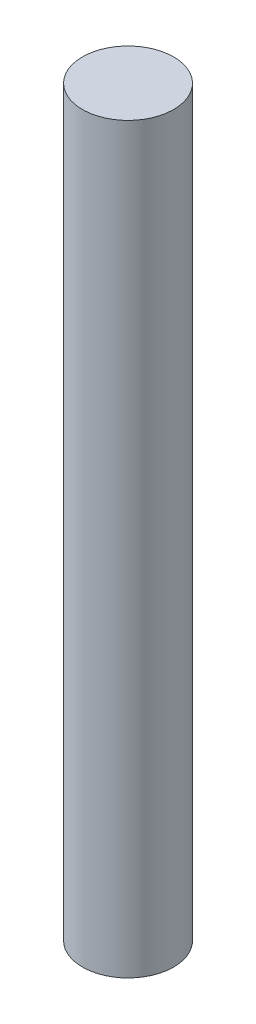
ISO-10303-21;
HEADER;
FILE_DESCRIPTION(('STEP AP214'),'2;1');
FILE_NAME('part.step','',(''),(''),'','','');
FILE_SCHEMA(('AUTOMOTIVE_DESIGN { 1 0 10303 214 1 1 1 1 }'));
ENDSEC;
DATA;
#1=APPLICATION_CONTEXT('core data for automotive mechanical design processes');
#2=APPLICATION_PROTOCOL_DEFINITION('international standard','automotive_design',2000,#1);
#3=PRODUCT_CONTEXT('',#1,'mechanical');
#4=PRODUCT('Part','Part','',(#3));
#5=PRODUCT_RELATED_PRODUCT_CATEGORY('part','',(#4));
#6=PRODUCT_DEFINITION_FORMATION('','',#4);
#7=PRODUCT_DEFINITION_CONTEXT('part definition',#1,'design');
#8=PRODUCT_DEFINITION('design','',#6,#7);
#9=PRODUCT_DEFINITION_SHAPE('','',#8);
#10=(LENGTH_UNIT() NAMED_UNIT(*) SI_UNIT(.MILLI.,.METRE.));
#11=(NAMED_UNIT(*) PLANE_ANGLE_UNIT() SI_UNIT($,.RADIAN.));
#12=(NAMED_UNIT(*) SI_UNIT($,.STERADIAN.) SOLID_ANGLE_UNIT());
#13=UNCERTAINTY_MEASURE_WITH_UNIT(LENGTH_MEASURE(1.E-05),#10,'distance_accuracy_value','');
#14=(GEOMETRIC_REPRESENTATION_CONTEXT(3) GLOBAL_UNCERTAINTY_ASSIGNED_CONTEXT((#13)) GLOBAL_UNIT_ASSIGNED_CONTEXT((#10,
#11,#12)) REPRESENTATION_CONTEXT('',''));
#15=CARTESIAN_POINT('',(0.,0.,0.));
#16=DIRECTION('',(0.,0.,1.));
#17=DIRECTION('',(1.,0.,0.));
#18=AXIS2_PLACEMENT_3D('',#15,#16,#17);
#19=CARTESIAN_POINT('',(0.,57.,0.));
#20=DIRECTION('',(0.,-1.,0.));
#21=DIRECTION('',(0.,0.,-1.));
#22=AXIS2_PLACEMENT_3D('',#19,#20,#21);
#23=CYLINDRICAL_SURFACE('',#22,3.5);
#24=CARTESIAN_POINT('',(0.,57.,0.));
#25=DIRECTION('',(0.,1.,0.));
#26=DIRECTION('',(0.,0.,1.));
#27=AXIS2_PLACEMENT_3D('',#24,#25,#26);
#28=CIRCLE('',#27,3.5);
#29=CARTESIAN_POINT('',(0.,57.,-3.5));
#30=VERTEX_POINT('',#29);
#31=EDGE_CURVE('E10',#30,#30,#28,.T.);
#32=CARTESIAN_POINT('',(0.,0.,0.));
#33=DIRECTION('',(0.,1.,0.));
#34=DIRECTION('',(0.,0.,1.));
#35=AXIS2_PLACEMENT_3D('',#32,#33,#34);
#36=CIRCLE('',#35,3.5);
#37=CARTESIAN_POINT('',(0.,0.,-3.5));
#38=VERTEX_POINT('',#37);
#39=EDGE_CURVE('E46',#38,#38,#36,.T.);
#40=CARTESIAN_POINT('',(0.,57.,-3.5));
#41=CARTESIAN_POINT('',(0.,56.40625,-3.5));
#42=CARTESIAN_POINT('',(0.,55.8125,-3.5));
#43=CARTESIAN_POINT('',(0.,54.625,-3.5));
#44=CARTESIAN_POINT('',(0.,54.03125,-3.5));
#45=CARTESIAN_POINT('',(0.,52.84375,-3.5));
#46=CARTESIAN_POINT('',(0.,52.25,-3.5));
#47=CARTESIAN_POINT('',(0.,51.0625,-3.5));
#48=CARTESIAN_POINT('',(0.,50.46875,-3.5));
#49=CARTESIAN_POINT('',(0.,49.28125,-3.5));
#50=CARTESIAN_POINT('',(0.,48.6875,-3.5));
#51=CARTESIAN_POINT('',(0.,47.5,-3.5));
#52=CARTESIAN_POINT('',(0.,46.90625,-3.5));
#53=CARTESIAN_POINT('',(0.,45.71875,-3.5));
#54=CARTESIAN_POINT('',(0.,45.125,-3.5));
#55=CARTESIAN_POINT('',(0.,43.9375,-3.5));
#56=CARTESIAN_POINT('',(0.,43.34375,-3.5));
#57=CARTESIAN_POINT('',(0.,42.15625,-3.5));
#58=CARTESIAN_POINT('',(0.,41.5625,-3.5));
#59=CARTESIAN_POINT('',(0.,40.375,-3.5));
#60=CARTESIAN_POINT('',(0.,39.78125,-3.5));
#61=CARTESIAN_POINT('',(0.,38.59375,-3.5));
#62=CARTESIAN_POINT('',(0.,38.,-3.5));
#63=CARTESIAN_POINT('',(0.,36.8125,-3.5));
#64=CARTESIAN_POINT('',(0.,36.21875,-3.5));
#65=CARTESIAN_POINT('',(0.,35.03125,-3.5));
#66=CARTESIAN_POINT('',(0.,34.4375,-3.5));
#67=CARTESIAN_POINT('',(0.,33.25,-3.5));
#68=CARTESIAN_POINT('',(0.,32.65625,-3.5));
#69=CARTESIAN_POINT('',(0.,31.46875,-3.5));
#70=CARTESIAN_POINT('',(0.,30.875,-3.5));
#71=CARTESIAN_POINT('',(0.,29.6875,-3.5));
#72=CARTESIAN_POINT('',(0.,29.09375,-3.5));
#73=CARTESIAN_POINT('',(0.,27.90625,-3.5));
#74=CARTESIAN_POINT('',(0.,27.3125,-3.5));
#75=CARTESIAN_POINT('',(0.,26.125,-3.5));
#76=CARTESIAN_POINT('',(0.,25.53125,-3.5));
#77=CARTESIAN_POINT('',(0.,24.34375,-3.5));
#78=CARTESIAN_POINT('',(0.,23.75,-3.5));
#79=CARTESIAN_POINT('',(0.,22.5625,-3.5));
#80=CARTESIAN_POINT('',(0.,21.96875,-3.5));
#81=CARTESIAN_POINT('',(0.,20.78125,-3.5));
#82=CARTESIAN_POINT('',(0.,20.1875,-3.5));
#83=CARTESIAN_POINT('',(0.,19.,-3.5));
#84=CARTESIAN_POINT('',(0.,18.40625,-3.5));
#85=CARTESIAN_POINT('',(0.,17.21875,-3.5));
#86=CARTESIAN_POINT('',(0.,16.625,-3.5));
#87=CARTESIAN_POINT('',(0.,15.4375,-3.5));
#88=CARTESIAN_POINT('',(0.,14.84375,-3.5));
#89=CARTESIAN_POINT('',(0.,13.65625,-3.5));
#90=CARTESIAN_POINT('',(0.,13.0625,-3.5));
#91=CARTESIAN_POINT('',(0.,11.875,-3.5));
#92=CARTESIAN_POINT('',(0.,11.28125,-3.5));
#93=CARTESIAN_POINT('',(0.,10.09375,-3.5));
#94=CARTESIAN_POINT('',(0.,9.5,-3.5));
#95=CARTESIAN_POINT('',(0.,8.3125,-3.5));
#96=CARTESIAN_POINT('',(0.,7.71875,-3.5));
#97=CARTESIAN_POINT('',(0.,6.53125,-3.5));
#98=CARTESIAN_POINT('',(0.,5.9375,-3.5));
#99=CARTESIAN_POINT('',(0.,4.75,-3.5));
#100=CARTESIAN_POINT('',(0.,4.15625,-3.5));
#101=CARTESIAN_POINT('',(0.,2.96875,-3.5));
#102=CARTESIAN_POINT('',(0.,2.375,-3.5));
#103=CARTESIAN_POINT('',(0.,1.1875,-3.5));
#104=CARTESIAN_POINT('',(0.,0.593749999999999,-3.5));
#105=CARTESIAN_POINT('',(0.,0.,-3.5));
#106=B_SPLINE_CURVE_WITH_KNOTS('',3,(#40,#41,#42,#43,#44,#45,#46,#47,#48,#49,#50,#51,#52,#53,
#54,#55,#56,#57,#58,#59,#60,#61,#62,#63,#64,#65,#66,#67,#68,#69,#70,#71,#72,#73,#74,#75,#76,#77,
#78,#79,#80,#81,#82,#83,#84,#85,#86,#87,#88,#89,#90,#91,#92,#93,#94,#95,#96,#97,#98,#99,#100,
#101,#102,#103,#104,#105),.UNSPECIFIED.,.F.,.F.,(4,2,2,2,2,2,2,2,2,2,2,2,2,2,2,2,2,2,2,2,2,2,2,
2,2,2,2,2,2,2,2,2,4),(0.,1.78125000000001,3.5625,5.34375,7.12500000000001,8.90625,10.6875,
12.46875,14.25,16.03125,17.8125,19.59375,21.375,23.15625,24.9375,26.71875,28.5,30.28125,32.0625,
33.84375,35.625,37.40625,39.1875,40.96875,42.75,44.53125,46.3125,48.09375,49.875,51.65625,
53.4375,55.21875,57.),.UNSPECIFIED.);
#107=EDGE_CURVE('BSEAM43',#30,#38,#106,.T.);
#108=ORIENTED_EDGE('',*,*,#31,.F.);
#109=ORIENTED_EDGE('',*,*,#39,.T.);
#110=ORIENTED_EDGE('',*,*,#107,.T.);
#111=ORIENTED_EDGE('',*,*,#107,.F.);
#112=EDGE_LOOP('',(#108,#110,#109,#111));
#113=FACE_BOUND('',#112,.T.);
#114=ADVANCED_FACE('F43',(#113),#23,.T.);
#115=CARTESIAN_POINT('',(0.,57.,0.));
#116=DIRECTION('',(0.,1.,0.));
#117=DIRECTION('',(0.,0.,1.));
#118=AXIS2_PLACEMENT_3D('',#115,#116,#117);
#119=PLANE('',#118);
#120=ORIENTED_EDGE('',*,*,#31,.T.);
#121=EDGE_LOOP('',(#120));
#122=FACE_BOUND('',#121,.T.);
#123=ADVANCED_FACE('F60',(#122),#119,.T.);
#124=CARTESIAN_POINT('',(0.,0.,0.));
#125=DIRECTION('',(0.,1.,0.));
#126=DIRECTION('',(0.,0.,1.));
#127=AXIS2_PLACEMENT_3D('',#124,#125,#126);
#128=PLANE('',#127);
#129=ORIENTED_EDGE('',*,*,#39,.F.);
#130=EDGE_LOOP('',(#129));
#131=FACE_BOUND('',#130,.T.);
#132=ADVANCED_FACE('F58',(#131),#128,.F.);
#133=CLOSED_SHELL('',(#114,#123,#132));
#134=MANIFOLD_SOLID_BREP('B2',#133);
#135=ADVANCED_BREP_SHAPE_REPRESENTATION('',(#18,#134),#14);
#136=SHAPE_DEFINITION_REPRESENTATION(#9,#135);
ENDSEC;
END-ISO-10303-21;
